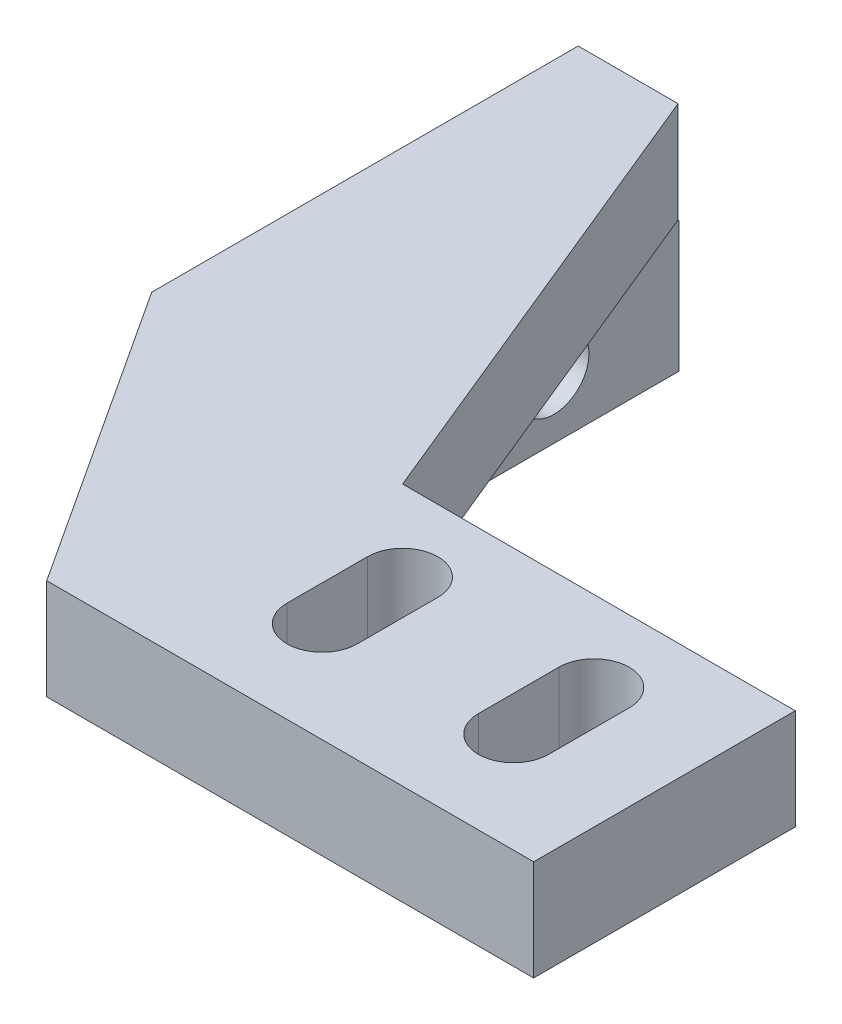
ISO-10303-21;
HEADER;
FILE_DESCRIPTION(('STEP AP214'),'2;1');
FILE_NAME('part.step','',(''),(''),'','','');
FILE_SCHEMA(('AUTOMOTIVE_DESIGN { 1 0 10303 214 1 1 1 1 }'));
ENDSEC;
DATA;
#1=APPLICATION_CONTEXT('core data for automotive mechanical design processes');
#2=APPLICATION_PROTOCOL_DEFINITION('international standard','automotive_design',2000,#1);
#3=PRODUCT_CONTEXT('',#1,'mechanical');
#4=PRODUCT('Part','Part','',(#3));
#5=PRODUCT_RELATED_PRODUCT_CATEGORY('part','',(#4));
#6=PRODUCT_DEFINITION_FORMATION('','',#4);
#7=PRODUCT_DEFINITION_CONTEXT('part definition',#1,'design');
#8=PRODUCT_DEFINITION('design','',#6,#7);
#9=PRODUCT_DEFINITION_SHAPE('','',#8);
#10=(LENGTH_UNIT() NAMED_UNIT(*) SI_UNIT(.MILLI.,.METRE.));
#11=(NAMED_UNIT(*) PLANE_ANGLE_UNIT() SI_UNIT($,.RADIAN.));
#12=(NAMED_UNIT(*) SI_UNIT($,.STERADIAN.) SOLID_ANGLE_UNIT());
#13=UNCERTAINTY_MEASURE_WITH_UNIT(LENGTH_MEASURE(1.E-05),#10,'distance_accuracy_value','');
#14=(GEOMETRIC_REPRESENTATION_CONTEXT(3) GLOBAL_UNCERTAINTY_ASSIGNED_CONTEXT((#13)) GLOBAL_UNIT_ASSIGNED_CONTEXT((#10,
#11,#12)) REPRESENTATION_CONTEXT('',''));
#15=CARTESIAN_POINT('',(0.,0.,0.));
#16=DIRECTION('',(0.,0.,1.));
#17=DIRECTION('',(1.,0.,0.));
#18=AXIS2_PLACEMENT_3D('',#15,#16,#17);
#19=CARTESIAN_POINT('',(-4.,33.5,16.));
#20=DIRECTION('',(-1.,0.,0.));
#21=DIRECTION('',(0.,0.,1.));
#22=AXIS2_PLACEMENT_3D('',#19,#20,#21);
#23=PLANE('',#22);
#24=CARTESIAN_POINT('',(-4.,36.5,-14.));
#25=DIRECTION('',(-1.,0.,0.));
#26=DIRECTION('',(0.,0.,1.));
#27=AXIS2_PLACEMENT_3D('',#24,#25,#26);
#28=CIRCLE('',#27,1.75);
#29=CARTESIAN_POINT('',(-4.,36.5,-12.25));
#30=VERTEX_POINT('',#29);
#31=EDGE_CURVE('E184',#30,#30,#28,.T.);
#32=ORIENTED_EDGE('',*,*,#31,.T.);
#33=EDGE_LOOP('',(#32));
#34=FACE_BOUND('',#33,.T.);
#35=CARTESIAN_POINT('',(-4.,36.5,-4.));
#36=DIRECTION('',(-1.,0.,0.));
#37=DIRECTION('',(0.,0.,1.));
#38=AXIS2_PLACEMENT_3D('',#35,#36,#37);
#39=CIRCLE('',#38,1.75);
#40=CARTESIAN_POINT('',(-4.,36.5,-2.25));
#41=VERTEX_POINT('',#40);
#42=EDGE_CURVE('E283',#41,#41,#39,.T.);
#43=ORIENTED_EDGE('',*,*,#42,.T.);
#44=EDGE_LOOP('',(#43));
#45=FACE_BOUND('',#44,.T.);
#46=DIRECTION('',(0.,1.,0.));
#47=VECTOR('',#46,1.);
#48=CARTESIAN_POINT('',(-4.,33.5,0.979024983401807));
#49=LINE('',#48,#47);
#50=CARTESIAN_POINT('',(-4.,33.5,0.979024983401807));
#51=VERTEX_POINT('',#50);
#52=CARTESIAN_POINT('',(-4.,40.,0.979024983401807));
#53=VERTEX_POINT('',#52);
#54=EDGE_CURVE('E161',#51,#53,#49,.T.);
#55=ORIENTED_EDGE('',*,*,#54,.F.);
#56=DIRECTION('',(0.,0.,1.));
#57=VECTOR('',#56,1.);
#58=CARTESIAN_POINT('',(-4.,33.5,16.));
#59=LINE('',#58,#57);
#60=CARTESIAN_POINT('',(-4.,33.5,-20.2123511891126));
#61=VERTEX_POINT('',#60);
#62=EDGE_CURVE('E287',#61,#51,#59,.T.);
#63=ORIENTED_EDGE('',*,*,#62,.F.);
#64=DIRECTION('',(0.,1.,0.));
#65=VECTOR('',#64,1.);
#66=CARTESIAN_POINT('',(-4.,33.5,-20.2123511891126));
#67=LINE('',#66,#65);
#68=CARTESIAN_POINT('',(-4.,40.,-20.2123511891126));
#69=VERTEX_POINT('',#68);
#70=EDGE_CURVE('E175',#61,#69,#67,.T.);
#71=ORIENTED_EDGE('',*,*,#70,.T.);
#72=DIRECTION('',(0.,0.,1.));
#73=VECTOR('',#72,1.);
#74=CARTESIAN_POINT('',(-4.,40.,16.));
#75=LINE('',#74,#73);
#76=CARTESIAN_POINT('',(-4.,40.,-20.1225292653854));
#77=VERTEX_POINT('',#76);
#78=EDGE_CURVE('E173',#69,#77,#75,.T.);
#79=ORIENTED_EDGE('',*,*,#78,.T.);
#80=EDGE_CURVE('E11',#77,#53,#75,.T.);
#81=ORIENTED_EDGE('',*,*,#80,.T.);
#82=EDGE_LOOP('',(#55,#63,#71,#79,#81));
#83=FACE_BOUND('',#82,.T.);
#84=ADVANCED_FACE('F32',(#34,#45,#83),#23,.F.);
#85=CARTESIAN_POINT('',(0.,33.5,0.));
#86=DIRECTION('',(0.,-1.,0.));
#87=DIRECTION('',(0.,0.,-1.));
#88=AXIS2_PLACEMENT_3D('',#85,#86,#87);
#89=PLANE('',#88);
#90=ORIENTED_EDGE('',*,*,#62,.T.);
#91=DIRECTION('',(1.,0.,0.));
#92=VECTOR('',#91,1.);
#93=CARTESIAN_POINT('',(-4.,33.5,0.979024983401807));
#94=LINE('',#93,#92);
#95=CARTESIAN_POINT('',(-9.,33.5,0.979024983401807));
#96=VERTEX_POINT('',#95);
#97=EDGE_CURVE('E160',#96,#51,#94,.T.);
#98=ORIENTED_EDGE('',*,*,#97,.F.);
#99=DIRECTION('',(0.,0.,-1.));
#100=VECTOR('',#99,1.);
#101=CARTESIAN_POINT('',(-9.,33.5,16.));
#102=LINE('',#101,#100);
#103=CARTESIAN_POINT('',(-9.,33.5,-20.2123511891126));
#104=VERTEX_POINT('',#103);
#105=EDGE_CURVE('E179',#96,#104,#102,.T.);
#106=ORIENTED_EDGE('',*,*,#105,.T.);
#107=DIRECTION('',(1.,0.,0.));
#108=VECTOR('',#107,1.);
#109=CARTESIAN_POINT('',(-9.,33.5,-20.2123511891126));
#110=LINE('',#109,#108);
#111=EDGE_CURVE('E182',#104,#61,#110,.T.);
#112=ORIENTED_EDGE('',*,*,#111,.T.);
#113=EDGE_LOOP('',(#90,#98,#106,#112));
#114=FACE_BOUND('',#113,.T.);
#115=ADVANCED_FACE('F365',(#114),#89,.T.);
#116=CARTESIAN_POINT('',(0.805132442555695,24.,16.));
#117=DIRECTION('',(0.837384923606884,0.,-0.546613656722821));
#118=DIRECTION('',(-0.546613656722821,0.,-0.837384923606884));
#119=AXIS2_PLACEMENT_3D('',#116,#117,#118);
#120=PLANE('',#119);
#121=DIRECTION('',(0.,1.,0.));
#122=VECTOR('',#121,1.);
#123=CARTESIAN_POINT('',(-9.,24.,0.979024983401803));
#124=LINE('',#123,#122);
#125=CARTESIAN_POINT('',(-9.,40.,0.979024983401803));
#126=VERTEX_POINT('',#125);
#127=CARTESIAN_POINT('',(-9.,45.,0.979024983401803));
#128=VERTEX_POINT('',#127);
#129=EDGE_CURVE('E272',#126,#128,#124,.T.);
#130=ORIENTED_EDGE('',*,*,#129,.F.);
#131=DIRECTION('',(0.546613656722821,0.,0.837384923606884));
#132=VECTOR('',#131,1.);
#133=CARTESIAN_POINT('',(-6.759046816549,40.,4.41205375473065));
#134=LINE('',#133,#132);
#135=CARTESIAN_POINT('',(0.805132442555695,40.,16.));
#136=VERTEX_POINT('',#135);
#137=EDGE_CURVE('E50',#126,#136,#134,.T.);
#138=ORIENTED_EDGE('',*,*,#137,.T.);
#139=DIRECTION('',(0.,1.,0.));
#140=VECTOR('',#139,1.);
#141=CARTESIAN_POINT('',(0.805132442555695,24.,16.));
#142=LINE('',#141,#140);
#143=CARTESIAN_POINT('',(0.805132442555695,45.,16.));
#144=VERTEX_POINT('',#143);
#145=EDGE_CURVE('E269',#136,#144,#142,.T.);
#146=ORIENTED_EDGE('',*,*,#145,.T.);
#147=DIRECTION('',(-0.546613656722821,0.,-0.837384923606883));
#148=VECTOR('',#147,1.);
#149=CARTESIAN_POINT('',(0.805132442555695,45.,16.));
#150=LINE('',#149,#148);
#151=EDGE_CURVE('E273',#144,#128,#150,.T.);
#152=ORIENTED_EDGE('',*,*,#151,.T.);
#153=EDGE_LOOP('',(#130,#138,#146,#152));
#154=FACE_BOUND('',#153,.T.);
#155=ADVANCED_FACE('F371',(#154),#120,.F.);
#156=CARTESIAN_POINT('',(0.,45.,0.));
#157=DIRECTION('',(0.,-1.,0.));
#158=DIRECTION('',(0.,0.,-1.));
#159=AXIS2_PLACEMENT_3D('',#156,#157,#158);
#160=PLANE('',#159);
#161=CARTESIAN_POINT('',(19.,45.,11.));
#162=DIRECTION('',(0.,1.,0.));
#163=DIRECTION('',(0.,0.,1.));
#164=AXIS2_PLACEMENT_3D('',#161,#162,#163);
#165=CIRCLE('',#164,1.75);
#166=CARTESIAN_POINT('',(17.25,45.,11.));
#167=VERTEX_POINT('',#166);
#168=CARTESIAN_POINT('',(20.75,45.,11.));
#169=VERTEX_POINT('',#168);
#170=EDGE_CURVE('E318',#167,#169,#165,.T.);
#171=ORIENTED_EDGE('',*,*,#170,.F.);
#172=DIRECTION('',(0.,0.,1.));
#173=VECTOR('',#172,1.);
#174=CARTESIAN_POINT('',(17.25,45.,11.));
#175=LINE('',#174,#173);
#176=CARTESIAN_POINT('',(17.25,45.,7.));
#177=VERTEX_POINT('',#176);
#178=EDGE_CURVE('E326',#177,#167,#175,.T.);
#179=ORIENTED_EDGE('',*,*,#178,.F.);
#180=CARTESIAN_POINT('',(19.,45.,6.99999999999999));
#181=DIRECTION('',(0.,1.,0.));
#182=DIRECTION('',(0.,0.,1.));
#183=AXIS2_PLACEMENT_3D('',#180,#181,#182);
#184=CIRCLE('',#183,1.75);
#185=CARTESIAN_POINT('',(20.75,45.,7.));
#186=VERTEX_POINT('',#185);
#187=EDGE_CURVE('E323',#186,#177,#184,.T.);
#188=ORIENTED_EDGE('',*,*,#187,.F.);
#189=DIRECTION('',(0.,0.,-1.));
#190=VECTOR('',#189,1.);
#191=CARTESIAN_POINT('',(20.75,45.,11.));
#192=LINE('',#191,#190);
#193=EDGE_CURVE('E320',#169,#186,#192,.T.);
#194=ORIENTED_EDGE('',*,*,#193,.F.);
#195=EDGE_LOOP('',(#171,#179,#188,#194));
#196=FACE_BOUND('',#195,.T.);
#197=DIRECTION('',(0.,0.,1.));
#198=VECTOR('',#197,1.);
#199=CARTESIAN_POINT('',(-9.,45.,16.));
#200=LINE('',#199,#198);
#201=CARTESIAN_POINT('',(-9.,45.,-20.2123511891126));
#202=VERTEX_POINT('',#201);
#203=EDGE_CURVE('E253',#202,#128,#200,.T.);
#204=ORIENTED_EDGE('',*,*,#203,.T.);
#205=ORIENTED_EDGE('',*,*,#151,.F.);
#206=DIRECTION('',(1.,0.,0.));
#207=VECTOR('',#206,1.);
#208=CARTESIAN_POINT('',(25.,45.,16.));
#209=LINE('',#208,#207);
#210=CARTESIAN_POINT('',(25.,45.,16.));
#211=VERTEX_POINT('',#210);
#212=EDGE_CURVE('E256',#144,#211,#209,.T.);
#213=ORIENTED_EDGE('',*,*,#212,.T.);
#214=DIRECTION('',(0.,0.,-1.));
#215=VECTOR('',#214,1.);
#216=CARTESIAN_POINT('',(25.,45.,16.));
#217=LINE('',#216,#215);
#218=CARTESIAN_POINT('',(25.,45.,3.));
#219=VERTEX_POINT('',#218);
#220=EDGE_CURVE('E213',#211,#219,#217,.T.);
#221=ORIENTED_EDGE('',*,*,#220,.T.);
#222=DIRECTION('',(-1.,0.,0.));
#223=VECTOR('',#222,1.);
#224=CARTESIAN_POINT('',(25.,45.,3.));
#225=LINE('',#224,#223);
#226=CARTESIAN_POINT('',(5.48787303789017,45.,3.));
#227=VERTEX_POINT('',#226);
#228=EDGE_CURVE('E208',#219,#227,#225,.T.);
#229=ORIENTED_EDGE('',*,*,#228,.T.);
#230=DIRECTION('',(-0.379614820608996,0.,-0.925144630841038));
#231=VECTOR('',#230,1.);
#232=CARTESIAN_POINT('',(-4.03685665173396,45.,-20.2123511891126));
#233=LINE('',#232,#231);
#234=CARTESIAN_POINT('',(-4.03685665173396,45.,-20.2123511891126));
#235=VERTEX_POINT('',#234);
#236=EDGE_CURVE('E231',#227,#235,#233,.T.);
#237=ORIENTED_EDGE('',*,*,#236,.T.);
#238=DIRECTION('',(-1.,0.,0.));
#239=VECTOR('',#238,1.);
#240=CARTESIAN_POINT('',(-9.,45.,-20.2123511891126));
#241=LINE('',#240,#239);
#242=EDGE_CURVE('E251',#235,#202,#241,.T.);
#243=ORIENTED_EDGE('',*,*,#242,.T.);
#244=EDGE_LOOP('',(#204,#205,#213,#221,#229,#237,#243));
#245=FACE_BOUND('',#244,.T.);
#246=CARTESIAN_POINT('',(9.49056589028713,45.,11.));
#247=DIRECTION('',(0.,1.,0.));
#248=DIRECTION('',(0.,0.,1.));
#249=AXIS2_PLACEMENT_3D('',#246,#247,#248);
#250=CIRCLE('',#249,1.75);
#251=CARTESIAN_POINT('',(7.74056589028713,45.,11.));
#252=VERTEX_POINT('',#251);
#253=CARTESIAN_POINT('',(11.2405658902871,45.,11.));
#254=VERTEX_POINT('',#253);
#255=EDGE_CURVE('E306',#252,#254,#250,.T.);
#256=ORIENTED_EDGE('',*,*,#255,.F.);
#257=DIRECTION('',(0.,0.,1.));
#258=VECTOR('',#257,1.);
#259=CARTESIAN_POINT('',(7.74056589028713,45.,11.));
#260=LINE('',#259,#258);
#261=CARTESIAN_POINT('',(7.74056589028713,45.,7.));
#262=VERTEX_POINT('',#261);
#263=EDGE_CURVE('E299',#262,#252,#260,.T.);
#264=ORIENTED_EDGE('',*,*,#263,.F.);
#265=CARTESIAN_POINT('',(9.49056589028713,45.,6.99999999999999));
#266=DIRECTION('',(0.,1.,0.));
#267=DIRECTION('',(0.,0.,1.));
#268=AXIS2_PLACEMENT_3D('',#265,#266,#267);
#269=CIRCLE('',#268,1.75);
#270=CARTESIAN_POINT('',(11.2405658902871,45.,7.));
#271=VERTEX_POINT('',#270);
#272=EDGE_CURVE('E591',#271,#262,#269,.T.);
#273=ORIENTED_EDGE('',*,*,#272,.F.);
#274=DIRECTION('',(0.,0.,-1.));
#275=VECTOR('',#274,1.);
#276=CARTESIAN_POINT('',(11.2405658902871,45.,11.));
#277=LINE('',#276,#275);
#278=EDGE_CURVE('E593',#254,#271,#277,.T.);
#279=ORIENTED_EDGE('',*,*,#278,.F.);
#280=EDGE_LOOP('',(#256,#264,#273,#279));
#281=FACE_BOUND('',#280,.T.);
#282=ADVANCED_FACE('F259',(#196,#245,#281),#160,.F.);
#283=CARTESIAN_POINT('',(0.,40.,0.));
#284=DIRECTION('',(0.,-1.,0.));
#285=DIRECTION('',(0.,0.,-1.));
#286=AXIS2_PLACEMENT_3D('',#283,#284,#285);
#287=PLANE('',#286);
#288=ORIENTED_EDGE('',*,*,#137,.F.);
#289=DIRECTION('',(-1.,0.,0.));
#290=VECTOR('',#289,1.);
#291=CARTESIAN_POINT('',(-4.,40.,0.979024983401807));
#292=LINE('',#291,#290);
#293=EDGE_CURVE('E154',#53,#126,#292,.T.);
#294=ORIENTED_EDGE('',*,*,#293,.F.);
#295=ORIENTED_EDGE('',*,*,#80,.F.);
#296=DIRECTION('',(-0.379614820608996,0.,-0.925144630841038));
#297=VECTOR('',#296,1.);
#298=CARTESIAN_POINT('',(-4.03685665173396,40.,-20.2123511891126));
#299=LINE('',#298,#297);
#300=CARTESIAN_POINT('',(5.48787303789017,40.,3.));
#301=VERTEX_POINT('',#300);
#302=EDGE_CURVE('E197',#301,#77,#299,.T.);
#303=ORIENTED_EDGE('',*,*,#302,.F.);
#304=DIRECTION('',(-1.,0.,0.));
#305=VECTOR('',#304,1.);
#306=CARTESIAN_POINT('',(25.,40.,3.));
#307=LINE('',#306,#305);
#308=CARTESIAN_POINT('',(25.,40.,3.));
#309=VERTEX_POINT('',#308);
#310=EDGE_CURVE('E198',#309,#301,#307,.T.);
#311=ORIENTED_EDGE('',*,*,#310,.F.);
#312=DIRECTION('',(0.,0.,-1.));
#313=VECTOR('',#312,1.);
#314=CARTESIAN_POINT('',(25.,40.,16.));
#315=LINE('',#314,#313);
#316=CARTESIAN_POINT('',(25.,40.,16.));
#317=VERTEX_POINT('',#316);
#318=EDGE_CURVE('E206',#317,#309,#315,.T.);
#319=ORIENTED_EDGE('',*,*,#318,.F.);
#320=DIRECTION('',(1.,0.,0.));
#321=VECTOR('',#320,1.);
#322=CARTESIAN_POINT('',(25.,40.,16.));
#323=LINE('',#322,#321);
#324=EDGE_CURVE('E36',#136,#317,#323,.T.);
#325=ORIENTED_EDGE('',*,*,#324,.F.);
#326=EDGE_LOOP('',(#288,#294,#295,#303,#311,#319,#325));
#327=FACE_BOUND('',#326,.T.);
#328=DIRECTION('',(0.,0.,1.));
#329=VECTOR('',#328,1.);
#330=CARTESIAN_POINT('',(17.25,40.,11.));
#331=LINE('',#330,#329);
#332=CARTESIAN_POINT('',(17.25,40.,7.));
#333=VERTEX_POINT('',#332);
#334=CARTESIAN_POINT('',(17.25,40.,11.));
#335=VERTEX_POINT('',#334);
#336=EDGE_CURVE('E321',#333,#335,#331,.T.);
#337=ORIENTED_EDGE('',*,*,#336,.T.);
#338=CARTESIAN_POINT('',(19.,40.,11.));
#339=DIRECTION('',(0.,1.,0.));
#340=DIRECTION('',(0.,0.,1.));
#341=AXIS2_PLACEMENT_3D('',#338,#339,#340);
#342=CIRCLE('',#341,1.75);
#343=CARTESIAN_POINT('',(20.75,40.,11.));
#344=VERTEX_POINT('',#343);
#345=EDGE_CURVE('E317',#335,#344,#342,.T.);
#346=ORIENTED_EDGE('',*,*,#345,.T.);
#347=DIRECTION('',(0.,0.,-1.));
#348=VECTOR('',#347,1.);
#349=CARTESIAN_POINT('',(20.75,40.,11.));
#350=LINE('',#349,#348);
#351=CARTESIAN_POINT('',(20.75,40.,7.));
#352=VERTEX_POINT('',#351);
#353=EDGE_CURVE('E330',#344,#352,#350,.T.);
#354=ORIENTED_EDGE('',*,*,#353,.T.);
#355=CARTESIAN_POINT('',(19.,40.,6.99999999999999));
#356=DIRECTION('',(0.,1.,0.));
#357=DIRECTION('',(0.,0.,1.));
#358=AXIS2_PLACEMENT_3D('',#355,#356,#357);
#359=CIRCLE('',#358,1.75);
#360=EDGE_CURVE('E333',#352,#333,#359,.T.);
#361=ORIENTED_EDGE('',*,*,#360,.T.);
#362=EDGE_LOOP('',(#337,#346,#354,#361));
#363=FACE_BOUND('',#362,.T.);
#364=DIRECTION('',(0.,0.,1.));
#365=VECTOR('',#364,1.);
#366=CARTESIAN_POINT('',(7.74056589028713,40.,11.));
#367=LINE('',#366,#365);
#368=CARTESIAN_POINT('',(7.74056589028713,40.,7.));
#369=VERTEX_POINT('',#368);
#370=CARTESIAN_POINT('',(7.74056589028713,40.,11.));
#371=VERTEX_POINT('',#370);
#372=EDGE_CURVE('E304',#369,#371,#367,.T.);
#373=ORIENTED_EDGE('',*,*,#372,.T.);
#374=CARTESIAN_POINT('',(9.49056589028713,40.,11.));
#375=DIRECTION('',(0.,1.,0.));
#376=DIRECTION('',(0.,0.,1.));
#377=AXIS2_PLACEMENT_3D('',#374,#375,#376);
#378=CIRCLE('',#377,1.75);
#379=CARTESIAN_POINT('',(11.2405658902871,40.,11.));
#380=VERTEX_POINT('',#379);
#381=EDGE_CURVE('E289',#371,#380,#378,.T.);
#382=ORIENTED_EDGE('',*,*,#381,.T.);
#383=DIRECTION('',(0.,0.,-1.));
#384=VECTOR('',#383,1.);
#385=CARTESIAN_POINT('',(11.2405658902871,40.,11.));
#386=LINE('',#385,#384);
#387=CARTESIAN_POINT('',(11.2405658902871,40.,7.));
#388=VERTEX_POINT('',#387);
#389=EDGE_CURVE('E291',#380,#388,#386,.T.);
#390=ORIENTED_EDGE('',*,*,#389,.T.);
#391=CARTESIAN_POINT('',(9.49056589028713,40.,6.99999999999999));
#392=DIRECTION('',(0.,1.,0.));
#393=DIRECTION('',(0.,0.,1.));
#394=AXIS2_PLACEMENT_3D('',#391,#392,#393);
#395=CIRCLE('',#394,1.75);
#396=EDGE_CURVE('E296',#388,#369,#395,.T.);
#397=ORIENTED_EDGE('',*,*,#396,.T.);
#398=EDGE_LOOP('',(#373,#382,#390,#397));
#399=FACE_BOUND('',#398,.T.);
#400=ADVANCED_FACE('F156',(#327,#363,#399),#287,.T.);
#401=CARTESIAN_POINT('',(25.,45.,3.));
#402=DIRECTION('',(0.,0.,1.));
#403=DIRECTION('',(1.,0.,0.));
#404=AXIS2_PLACEMENT_3D('',#401,#402,#403);
#405=PLANE('',#404);
#406=ORIENTED_EDGE('',*,*,#310,.T.);
#407=DIRECTION('',(0.,-1.,0.));
#408=VECTOR('',#407,1.);
#409=CARTESIAN_POINT('',(5.48787303789017,45.,3.));
#410=LINE('',#409,#408);
#411=EDGE_CURVE('E42',#227,#301,#410,.T.);
#412=ORIENTED_EDGE('',*,*,#411,.F.);
#413=ORIENTED_EDGE('',*,*,#228,.F.);
#414=DIRECTION('',(0.,-1.,0.));
#415=VECTOR('',#414,1.);
#416=CARTESIAN_POINT('',(25.,45.,3.));
#417=LINE('',#416,#415);
#418=EDGE_CURVE('E209',#219,#309,#417,.T.);
#419=ORIENTED_EDGE('',*,*,#418,.T.);
#420=EDGE_LOOP('',(#406,#412,#413,#419));
#421=FACE_BOUND('',#420,.T.);
#422=ADVANCED_FACE('F34',(#421),#405,.F.);
#423=CARTESIAN_POINT('',(-4.03685665173396,45.,-20.2123511891126));
#424=DIRECTION('',(-0.925144630841037,0.,0.379614820608996));
#425=DIRECTION('',(0.379614820608996,0.,0.925144630841038));
#426=AXIS2_PLACEMENT_3D('',#423,#424,#425);
#427=PLANE('',#426);
#428=ORIENTED_EDGE('',*,*,#302,.T.);
#429=CARTESIAN_POINT('',(-4.03685665173396,40.,-20.2123511891126));
#430=VERTEX_POINT('',#429);
#431=EDGE_CURVE('E194',#77,#430,#299,.T.);
#432=ORIENTED_EDGE('',*,*,#431,.T.);
#433=DIRECTION('',(0.,-1.,0.));
#434=VECTOR('',#433,1.);
#435=CARTESIAN_POINT('',(-4.03685665173396,45.,-20.2123511891126));
#436=LINE('',#435,#434);
#437=EDGE_CURVE('E199',#235,#430,#436,.T.);
#438=ORIENTED_EDGE('',*,*,#437,.F.);
#439=ORIENTED_EDGE('',*,*,#236,.F.);
#440=ORIENTED_EDGE('',*,*,#411,.T.);
#441=EDGE_LOOP('',(#428,#432,#438,#439,#440));
#442=FACE_BOUND('',#441,.T.);
#443=ADVANCED_FACE('F230',(#442),#427,.F.);
#444=CARTESIAN_POINT('',(-9.,45.,-20.2123511891126));
#445=DIRECTION('',(0.,0.,1.));
#446=DIRECTION('',(1.,0.,0.));
#447=AXIS2_PLACEMENT_3D('',#444,#445,#446);
#448=PLANE('',#447);
#449=ORIENTED_EDGE('',*,*,#437,.T.);
#450=DIRECTION('',(1.,0.,0.));
#451=VECTOR('',#450,1.);
#452=CARTESIAN_POINT('',(-9.,40.,-20.2123511891126));
#453=LINE('',#452,#451);
#454=EDGE_CURVE('E180',#430,#69,#453,.T.);
#455=ORIENTED_EDGE('',*,*,#454,.T.);
#456=ORIENTED_EDGE('',*,*,#70,.F.);
#457=ORIENTED_EDGE('',*,*,#111,.F.);
#458=DIRECTION('',(0.,-1.,0.));
#459=VECTOR('',#458,1.);
#460=CARTESIAN_POINT('',(-9.,45.,-20.2123511891126));
#461=LINE('',#460,#459);
#462=EDGE_CURVE('E215',#202,#104,#461,.T.);
#463=ORIENTED_EDGE('',*,*,#462,.F.);
#464=ORIENTED_EDGE('',*,*,#242,.F.);
#465=EDGE_LOOP('',(#449,#455,#456,#457,#463,#464));
#466=FACE_BOUND('',#465,.T.);
#467=ADVANCED_FACE('F462',(#466),#448,.F.);
#468=CARTESIAN_POINT('',(-9.,45.,16.));
#469=DIRECTION('',(1.,0.,0.));
#470=DIRECTION('',(0.,0.,-1.));
#471=AXIS2_PLACEMENT_3D('',#468,#469,#470);
#472=PLANE('',#471);
#473=CARTESIAN_POINT('',(-9.,36.5,-4.));
#474=DIRECTION('',(-1.,0.,0.));
#475=DIRECTION('',(0.,0.,-1.));
#476=AXIS2_PLACEMENT_3D('',#473,#474,#475);
#477=CIRCLE('',#476,1.75);
#478=CARTESIAN_POINT('',(-9.,36.5,-5.75));
#479=VERTEX_POINT('',#478);
#480=EDGE_CURVE('E280',#479,#479,#477,.T.);
#481=ORIENTED_EDGE('',*,*,#480,.F.);
#482=EDGE_LOOP('',(#481));
#483=FACE_BOUND('',#482,.T.);
#484=CARTESIAN_POINT('',(-9.,36.5,-14.));
#485=DIRECTION('',(-1.,0.,0.));
#486=DIRECTION('',(0.,0.,1.));
#487=AXIS2_PLACEMENT_3D('',#484,#485,#486);
#488=CIRCLE('',#487,1.75);
#489=CARTESIAN_POINT('',(-9.,36.5,-12.25));
#490=VERTEX_POINT('',#489);
#491=EDGE_CURVE('E284',#490,#490,#488,.T.);
#492=ORIENTED_EDGE('',*,*,#491,.F.);
#493=EDGE_LOOP('',(#492));
#494=FACE_BOUND('',#493,.T.);
#495=ORIENTED_EDGE('',*,*,#105,.F.);
#496=EDGE_CURVE('E275',#96,#126,#124,.T.);
#497=ORIENTED_EDGE('',*,*,#496,.T.);
#498=ORIENTED_EDGE('',*,*,#129,.T.);
#499=ORIENTED_EDGE('',*,*,#203,.F.);
#500=ORIENTED_EDGE('',*,*,#462,.T.);
#501=EDGE_LOOP('',(#495,#497,#498,#499,#500));
#502=FACE_BOUND('',#501,.T.);
#503=ADVANCED_FACE('F457',(#483,#494,#502),#472,.F.);
#504=CARTESIAN_POINT('',(25.,45.,16.));
#505=DIRECTION('',(0.,0.,-1.));
#506=DIRECTION('',(-1.,0.,0.));
#507=AXIS2_PLACEMENT_3D('',#504,#505,#506);
#508=PLANE('',#507);
#509=ORIENTED_EDGE('',*,*,#212,.F.);
#510=ORIENTED_EDGE('',*,*,#145,.F.);
#511=ORIENTED_EDGE('',*,*,#324,.T.);
#512=DIRECTION('',(0.,-1.,0.));
#513=VECTOR('',#512,1.);
#514=CARTESIAN_POINT('',(25.,45.,16.));
#515=LINE('',#514,#513);
#516=EDGE_CURVE('E212',#211,#317,#515,.T.);
#517=ORIENTED_EDGE('',*,*,#516,.F.);
#518=EDGE_LOOP('',(#509,#510,#511,#517));
#519=FACE_BOUND('',#518,.T.);
#520=ADVANCED_FACE('F268',(#519),#508,.F.);
#521=CARTESIAN_POINT('',(25.,45.,16.));
#522=DIRECTION('',(-1.,0.,0.));
#523=DIRECTION('',(0.,0.,1.));
#524=AXIS2_PLACEMENT_3D('',#521,#522,#523);
#525=PLANE('',#524);
#526=ORIENTED_EDGE('',*,*,#318,.T.);
#527=ORIENTED_EDGE('',*,*,#418,.F.);
#528=ORIENTED_EDGE('',*,*,#220,.F.);
#529=ORIENTED_EDGE('',*,*,#516,.T.);
#530=EDGE_LOOP('',(#526,#527,#528,#529));
#531=FACE_BOUND('',#530,.T.);
#532=ADVANCED_FACE('F265',(#531),#525,.F.);
#533=CARTESIAN_POINT('',(19.,45.,11.));
#534=DIRECTION('',(0.,-1.,0.));
#535=DIRECTION('',(0.,0.,-1.));
#536=AXIS2_PLACEMENT_3D('',#533,#534,#535);
#537=CYLINDRICAL_SURFACE('',#536,1.75);
#538=ORIENTED_EDGE('',*,*,#345,.F.);
#539=DIRECTION('',(0.,-1.,0.));
#540=VECTOR('',#539,1.);
#541=CARTESIAN_POINT('',(17.25,45.,11.));
#542=LINE('',#541,#540);
#543=EDGE_CURVE('E328',#167,#335,#542,.T.);
#544=ORIENTED_EDGE('',*,*,#543,.F.);
#545=ORIENTED_EDGE('',*,*,#170,.T.);
#546=DIRECTION('',(0.,-1.,0.));
#547=VECTOR('',#546,1.);
#548=CARTESIAN_POINT('',(20.75,45.,11.));
#549=LINE('',#548,#547);
#550=EDGE_CURVE('E238',#169,#344,#549,.T.);
#551=ORIENTED_EDGE('',*,*,#550,.T.);
#552=EDGE_LOOP('',(#538,#544,#545,#551));
#553=FACE_BOUND('',#552,.T.);
#554=ADVANCED_FACE('F354',(#553),#537,.F.);
#555=CARTESIAN_POINT('',(20.75,45.,11.));
#556=DIRECTION('',(-1.,0.,0.));
#557=DIRECTION('',(0.,0.,1.));
#558=AXIS2_PLACEMENT_3D('',#555,#556,#557);
#559=PLANE('',#558);
#560=ORIENTED_EDGE('',*,*,#353,.F.);
#561=ORIENTED_EDGE('',*,*,#550,.F.);
#562=ORIENTED_EDGE('',*,*,#193,.T.);
#563=DIRECTION('',(0.,-1.,0.));
#564=VECTOR('',#563,1.);
#565=CARTESIAN_POINT('',(20.75,45.,7.));
#566=LINE('',#565,#564);
#567=EDGE_CURVE('E240',#186,#352,#566,.T.);
#568=ORIENTED_EDGE('',*,*,#567,.T.);
#569=EDGE_LOOP('',(#560,#561,#562,#568));
#570=FACE_BOUND('',#569,.T.);
#571=ADVANCED_FACE('F350',(#570),#559,.T.);
#572=CARTESIAN_POINT('',(19.,45.,6.99999999999999));
#573=DIRECTION('',(0.,-1.,0.));
#574=DIRECTION('',(0.,0.,-1.));
#575=AXIS2_PLACEMENT_3D('',#572,#573,#574);
#576=CYLINDRICAL_SURFACE('',#575,1.75);
#577=ORIENTED_EDGE('',*,*,#360,.F.);
#578=ORIENTED_EDGE('',*,*,#567,.F.);
#579=ORIENTED_EDGE('',*,*,#187,.T.);
#580=DIRECTION('',(0.,-1.,0.));
#581=VECTOR('',#580,1.);
#582=CARTESIAN_POINT('',(17.25,45.,7.));
#583=LINE('',#582,#581);
#584=EDGE_CURVE('E245',#177,#333,#583,.T.);
#585=ORIENTED_EDGE('',*,*,#584,.T.);
#586=EDGE_LOOP('',(#577,#578,#579,#585));
#587=FACE_BOUND('',#586,.T.);
#588=ADVANCED_FACE('F342',(#587),#576,.F.);
#589=CARTESIAN_POINT('',(17.25,45.,11.));
#590=DIRECTION('',(1.,0.,0.));
#591=DIRECTION('',(0.,0.,-1.));
#592=AXIS2_PLACEMENT_3D('',#589,#590,#591);
#593=PLANE('',#592);
#594=ORIENTED_EDGE('',*,*,#336,.F.);
#595=ORIENTED_EDGE('',*,*,#584,.F.);
#596=ORIENTED_EDGE('',*,*,#178,.T.);
#597=ORIENTED_EDGE('',*,*,#543,.T.);
#598=EDGE_LOOP('',(#594,#595,#596,#597));
#599=FACE_BOUND('',#598,.T.);
#600=ADVANCED_FACE('F347',(#599),#593,.T.);
#601=CARTESIAN_POINT('',(9.49056589028713,45.,11.));
#602=DIRECTION('',(0.,-1.,0.));
#603=DIRECTION('',(0.,0.,-1.));
#604=AXIS2_PLACEMENT_3D('',#601,#602,#603);
#605=CYLINDRICAL_SURFACE('',#604,1.75);
#606=ORIENTED_EDGE('',*,*,#381,.F.);
#607=DIRECTION('',(0.,-1.,0.));
#608=VECTOR('',#607,1.);
#609=CARTESIAN_POINT('',(7.74056589028713,45.,11.));
#610=LINE('',#609,#608);
#611=EDGE_CURVE('E307',#252,#371,#610,.T.);
#612=ORIENTED_EDGE('',*,*,#611,.F.);
#613=ORIENTED_EDGE('',*,*,#255,.T.);
#614=DIRECTION('',(0.,-1.,0.));
#615=VECTOR('',#614,1.);
#616=CARTESIAN_POINT('',(11.2405658902871,45.,11.));
#617=LINE('',#616,#615);
#618=EDGE_CURVE('E314',#254,#380,#617,.T.);
#619=ORIENTED_EDGE('',*,*,#618,.T.);
#620=EDGE_LOOP('',(#606,#612,#613,#619));
#621=FACE_BOUND('',#620,.T.);
#622=ADVANCED_FACE('F389',(#621),#605,.F.);
#623=CARTESIAN_POINT('',(11.2405658902871,45.,11.));
#624=DIRECTION('',(-1.,0.,0.));
#625=DIRECTION('',(0.,0.,1.));
#626=AXIS2_PLACEMENT_3D('',#623,#624,#625);
#627=PLANE('',#626);
#628=ORIENTED_EDGE('',*,*,#389,.F.);
#629=ORIENTED_EDGE('',*,*,#618,.F.);
#630=ORIENTED_EDGE('',*,*,#278,.T.);
#631=DIRECTION('',(0.,-1.,0.));
#632=VECTOR('',#631,1.);
#633=CARTESIAN_POINT('',(11.2405658902871,45.,7.));
#634=LINE('',#633,#632);
#635=EDGE_CURVE('E312',#271,#388,#634,.T.);
#636=ORIENTED_EDGE('',*,*,#635,.T.);
#637=EDGE_LOOP('',(#628,#629,#630,#636));
#638=FACE_BOUND('',#637,.T.);
#639=ADVANCED_FACE('F385',(#638),#627,.T.);
#640=CARTESIAN_POINT('',(9.49056589028713,45.,6.99999999999999));
#641=DIRECTION('',(0.,-1.,0.));
#642=DIRECTION('',(0.,0.,-1.));
#643=AXIS2_PLACEMENT_3D('',#640,#641,#642);
#644=CYLINDRICAL_SURFACE('',#643,1.75);
#645=ORIENTED_EDGE('',*,*,#396,.F.);
#646=ORIENTED_EDGE('',*,*,#635,.F.);
#647=ORIENTED_EDGE('',*,*,#272,.T.);
#648=DIRECTION('',(0.,-1.,0.));
#649=VECTOR('',#648,1.);
#650=CARTESIAN_POINT('',(7.74056589028713,45.,7.));
#651=LINE('',#650,#649);
#652=EDGE_CURVE('E310',#262,#369,#651,.T.);
#653=ORIENTED_EDGE('',*,*,#652,.T.);
#654=EDGE_LOOP('',(#645,#646,#647,#653));
#655=FACE_BOUND('',#654,.T.);
#656=ADVANCED_FACE('F381',(#655),#644,.F.);
#657=CARTESIAN_POINT('',(7.74056589028713,45.,11.));
#658=DIRECTION('',(1.,0.,0.));
#659=DIRECTION('',(0.,0.,-1.));
#660=AXIS2_PLACEMENT_3D('',#657,#658,#659);
#661=PLANE('',#660);
#662=ORIENTED_EDGE('',*,*,#372,.F.);
#663=ORIENTED_EDGE('',*,*,#652,.F.);
#664=ORIENTED_EDGE('',*,*,#263,.T.);
#665=ORIENTED_EDGE('',*,*,#611,.T.);
#666=EDGE_LOOP('',(#662,#663,#664,#665));
#667=FACE_BOUND('',#666,.T.);
#668=ADVANCED_FACE('F378',(#667),#661,.T.);
#669=CARTESIAN_POINT('',(0.,40.,0.));
#670=DIRECTION('',(0.,-1.,0.));
#671=DIRECTION('',(0.,0.,-1.));
#672=AXIS2_PLACEMENT_3D('',#669,#670,#671);
#673=PLANE('',#672);
#674=ORIENTED_EDGE('',*,*,#431,.F.);
#675=ORIENTED_EDGE('',*,*,#78,.F.);
#676=ORIENTED_EDGE('',*,*,#454,.F.);
#677=EDGE_LOOP('',(#674,#675,#676));
#678=FACE_BOUND('',#677,.T.);
#679=ADVANCED_FACE('F377',(#678),#673,.F.);
#680=CARTESIAN_POINT('',(-3.,36.5,-14.));
#681=DIRECTION('',(-1.,0.,0.));
#682=DIRECTION('',(0.,0.,1.));
#683=AXIS2_PLACEMENT_3D('',#680,#681,#682);
#684=CYLINDRICAL_SURFACE('',#683,1.75);
#685=ORIENTED_EDGE('',*,*,#491,.T.);
#686=EDGE_LOOP('',(#685));
#687=FACE_BOUND('',#686,.T.);
#688=ORIENTED_EDGE('',*,*,#31,.F.);
#689=EDGE_LOOP('',(#688));
#690=FACE_BOUND('',#689,.T.);
#691=ADVANCED_FACE('F428',(#687,#690),#684,.F.);
#692=CARTESIAN_POINT('',(-3.,36.5,-4.));
#693=DIRECTION('',(-1.,0.,0.));
#694=DIRECTION('',(0.,0.,1.));
#695=AXIS2_PLACEMENT_3D('',#692,#693,#694);
#696=CYLINDRICAL_SURFACE('',#695,1.75);
#697=ORIENTED_EDGE('',*,*,#480,.T.);
#698=EDGE_LOOP('',(#697));
#699=FACE_BOUND('',#698,.T.);
#700=ORIENTED_EDGE('',*,*,#42,.F.);
#701=EDGE_LOOP('',(#700));
#702=FACE_BOUND('',#701,.T.);
#703=ADVANCED_FACE('F435',(#699,#702),#696,.F.);
#704=CARTESIAN_POINT('',(0.,0.,0.979024983401807));
#705=DIRECTION('',(0.,0.,1.));
#706=DIRECTION('',(1.,0.,0.));
#707=AXIS2_PLACEMENT_3D('',#704,#705,#706);
#708=PLANE('',#707);
#709=ORIENTED_EDGE('',*,*,#54,.T.);
#710=ORIENTED_EDGE('',*,*,#293,.T.);
#711=ORIENTED_EDGE('',*,*,#496,.F.);
#712=ORIENTED_EDGE('',*,*,#97,.T.);
#713=EDGE_LOOP('',(#709,#710,#711,#712));
#714=FACE_BOUND('',#713,.T.);
#715=ADVANCED_FACE('F164',(#714),#708,.T.);
#716=CLOSED_SHELL('',(#84,#115,#155,#282,#400,#422,#443,#467,#503,#520,#532,#554,#571,#588,#600,
#622,#639,#656,#668,#679,#691,#703,#715));
#717=MANIFOLD_SOLID_BREP('B2',#716);
#718=ADVANCED_BREP_SHAPE_REPRESENTATION('',(#18,#717),#14);
#719=SHAPE_DEFINITION_REPRESENTATION(#9,#718);
ENDSEC;
END-ISO-10303-21;
